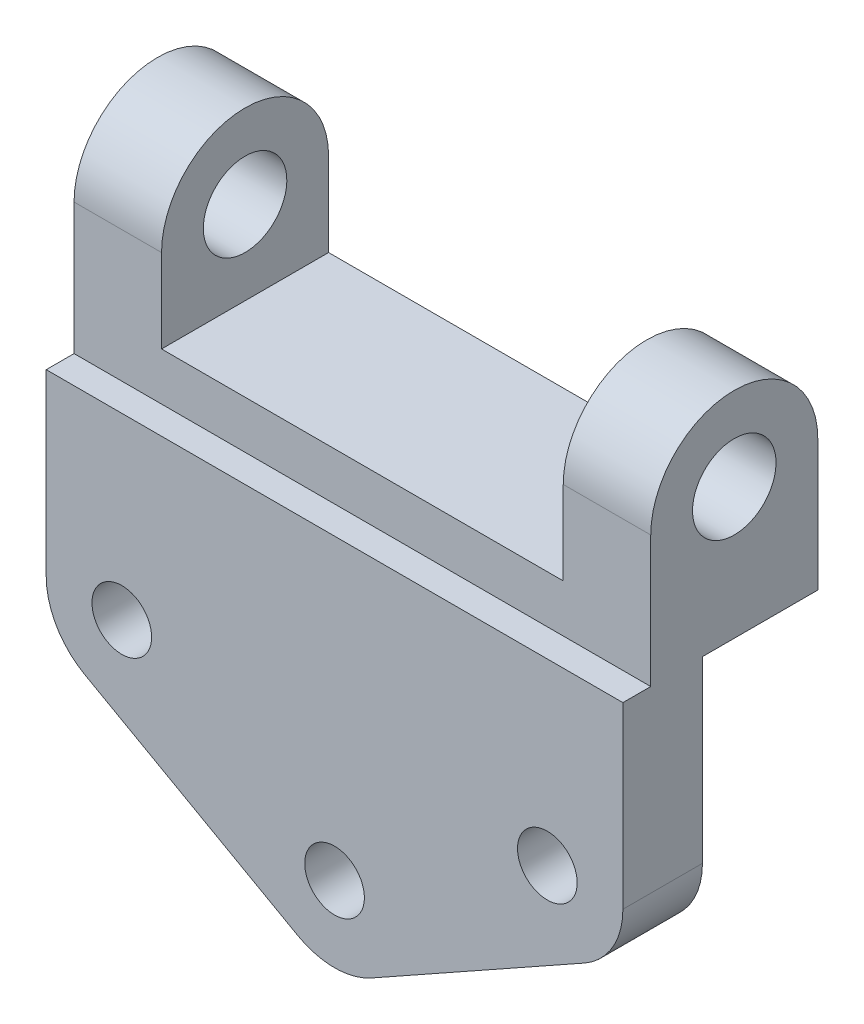
ISO-10303-21;
HEADER;
FILE_DESCRIPTION(('STEP AP214'),'2;1');
FILE_NAME('part.step','',(''),(''),'','','');
FILE_SCHEMA(('AUTOMOTIVE_DESIGN { 1 0 10303 214 1 1 1 1 }'));
ENDSEC;
DATA;
#1=APPLICATION_CONTEXT('core data for automotive mechanical design processes');
#2=APPLICATION_PROTOCOL_DEFINITION('international standard','automotive_design',2000,#1);
#3=PRODUCT_CONTEXT('',#1,'mechanical');
#4=PRODUCT('Part','Part','',(#3));
#5=PRODUCT_RELATED_PRODUCT_CATEGORY('part','',(#4));
#6=PRODUCT_DEFINITION_FORMATION('','',#4);
#7=PRODUCT_DEFINITION_CONTEXT('part definition',#1,'design');
#8=PRODUCT_DEFINITION('design','',#6,#7);
#9=PRODUCT_DEFINITION_SHAPE('','',#8);
#10=(LENGTH_UNIT() NAMED_UNIT(*) SI_UNIT(.MILLI.,.METRE.));
#11=(NAMED_UNIT(*) PLANE_ANGLE_UNIT() SI_UNIT($,.RADIAN.));
#12=(NAMED_UNIT(*) SI_UNIT($,.STERADIAN.) SOLID_ANGLE_UNIT());
#13=UNCERTAINTY_MEASURE_WITH_UNIT(LENGTH_MEASURE(1.E-05),#10,'distance_accuracy_value','');
#14=(GEOMETRIC_REPRESENTATION_CONTEXT(3) GLOBAL_UNCERTAINTY_ASSIGNED_CONTEXT((#13)) GLOBAL_UNIT_ASSIGNED_CONTEXT((#10,
#11,#12)) REPRESENTATION_CONTEXT('',''));
#15=CARTESIAN_POINT('',(0.,0.,0.));
#16=DIRECTION('',(0.,0.,1.));
#17=DIRECTION('',(1.,0.,0.));
#18=AXIS2_PLACEMENT_3D('',#15,#16,#17);
#19=CARTESIAN_POINT('',(72.5,0.,20.));
#20=DIRECTION('',(1.,0.,0.));
#21=DIRECTION('',(0.,1.,0.));
#22=AXIS2_PLACEMENT_3D('',#19,#20,#21);
#23=PLANE('',#22);
#24=CARTESIAN_POINT('',(72.5,33.,-8.));
#25=DIRECTION('',(1.,0.,0.));
#26=DIRECTION('',(0.,1.,0.));
#27=AXIS2_PLACEMENT_3D('',#24,#25,#26);
#28=CIRCLE('',#27,10.5);
#29=CARTESIAN_POINT('',(72.5,43.5,-8.));
#30=VERTEX_POINT('',#29);
#31=EDGE_CURVE('E557',#30,#30,#28,.T.);
#32=ORIENTED_EDGE('',*,*,#31,.F.);
#33=EDGE_LOOP('',(#32));
#34=FACE_BOUND('',#33,.T.);
#35=DIRECTION('',(0.,-1.,0.));
#36=VECTOR('',#35,1.);
#37=CARTESIAN_POINT('',(72.5,0.,-29.));
#38=LINE('',#37,#36);
#39=CARTESIAN_POINT('',(72.5,33.,-29.));
#40=VERTEX_POINT('',#39);
#41=CARTESIAN_POINT('',(72.5,0.,-29.));
#42=VERTEX_POINT('',#41);
#43=EDGE_CURVE('E232',#40,#42,#38,.T.);
#44=ORIENTED_EDGE('',*,*,#43,.F.);
#45=CARTESIAN_POINT('',(72.5,33.,-8.));
#46=DIRECTION('',(1.,0.,0.));
#47=DIRECTION('',(0.,1.,0.));
#48=AXIS2_PLACEMENT_3D('',#45,#46,#47);
#49=CIRCLE('',#48,21.);
#50=CARTESIAN_POINT('',(72.5,33.,13.));
#51=VERTEX_POINT('',#50);
#52=EDGE_CURVE('E216',#40,#51,#49,.T.);
#53=ORIENTED_EDGE('',*,*,#52,.T.);
#54=DIRECTION('',(0.,-1.,0.));
#55=VECTOR('',#54,1.);
#56=CARTESIAN_POINT('',(72.5,0.,13.));
#57=LINE('',#56,#55);
#58=CARTESIAN_POINT('',(72.5,0.,13.));
#59=VERTEX_POINT('',#58);
#60=EDGE_CURVE('E354',#51,#59,#57,.T.);
#61=ORIENTED_EDGE('',*,*,#60,.T.);
#62=DIRECTION('',(0.,0.,-1.));
#63=VECTOR('',#62,1.);
#64=CARTESIAN_POINT('',(72.5,0.,20.));
#65=LINE('',#64,#63);
#66=CARTESIAN_POINT('',(72.5,0.,20.));
#67=VERTEX_POINT('',#66);
#68=EDGE_CURVE('E334',#67,#59,#65,.T.);
#69=ORIENTED_EDGE('',*,*,#68,.F.);
#70=DIRECTION('',(0.,-1.,0.));
#71=VECTOR('',#70,1.);
#72=CARTESIAN_POINT('',(72.5,0.,20.));
#73=LINE('',#72,#71);
#74=CARTESIAN_POINT('',(72.5,-45.,20.));
#75=VERTEX_POINT('',#74);
#76=EDGE_CURVE('E276',#67,#75,#73,.T.);
#77=ORIENTED_EDGE('',*,*,#76,.T.);
#78=DIRECTION('',(0.,0.,-1.));
#79=VECTOR('',#78,1.);
#80=CARTESIAN_POINT('',(72.5,-45.,20.));
#81=LINE('',#80,#79);
#82=CARTESIAN_POINT('',(72.5,-45.,0.));
#83=VERTEX_POINT('',#82);
#84=EDGE_CURVE('E337',#75,#83,#81,.T.);
#85=ORIENTED_EDGE('',*,*,#84,.T.);
#86=DIRECTION('',(0.,-1.,0.));
#87=VECTOR('',#86,1.);
#88=CARTESIAN_POINT('',(72.5,0.,0.));
#89=LINE('',#88,#87);
#90=CARTESIAN_POINT('',(72.5,0.,0.));
#91=VERTEX_POINT('',#90);
#92=EDGE_CURVE('E309',#91,#83,#89,.T.);
#93=ORIENTED_EDGE('',*,*,#92,.F.);
#94=DIRECTION('',(0.,0.,-1.));
#95=VECTOR('',#94,1.);
#96=CARTESIAN_POINT('',(72.5,0.,13.));
#97=LINE('',#96,#95);
#98=EDGE_CURVE('E240',#91,#42,#97,.T.);
#99=ORIENTED_EDGE('',*,*,#98,.T.);
#100=EDGE_LOOP('',(#44,#53,#61,#69,#77,#85,#93,#99));
#101=FACE_BOUND('',#100,.T.);
#102=ADVANCED_FACE('F105',(#34,#101),#23,.T.);
#103=CARTESIAN_POINT('',(-72.5,0.,20.));
#104=DIRECTION('',(1.,0.,0.));
#105=DIRECTION('',(0.,1.,0.));
#106=AXIS2_PLACEMENT_3D('',#103,#104,#105);
#107=PLANE('',#106);
#108=CARTESIAN_POINT('',(-72.5,33.,-8.));
#109=DIRECTION('',(1.,0.,0.));
#110=DIRECTION('',(0.,1.,0.));
#111=AXIS2_PLACEMENT_3D('',#108,#109,#110);
#112=CIRCLE('',#111,10.5);
#113=CARTESIAN_POINT('',(-72.5,43.5,-8.));
#114=VERTEX_POINT('',#113);
#115=EDGE_CURVE('E227',#114,#114,#112,.T.);
#116=ORIENTED_EDGE('',*,*,#115,.T.);
#117=EDGE_LOOP('',(#116));
#118=FACE_BOUND('',#117,.T.);
#119=CARTESIAN_POINT('',(-72.5,33.,-8.));
#120=DIRECTION('',(1.,0.,0.));
#121=DIRECTION('',(0.,1.,0.));
#122=AXIS2_PLACEMENT_3D('',#119,#120,#121);
#123=CIRCLE('',#122,21.);
#124=CARTESIAN_POINT('',(-72.5,33.,-29.));
#125=VERTEX_POINT('',#124);
#126=CARTESIAN_POINT('',(-72.5,33.,13.));
#127=VERTEX_POINT('',#126);
#128=EDGE_CURVE('E244',#125,#127,#123,.T.);
#129=ORIENTED_EDGE('',*,*,#128,.F.);
#130=DIRECTION('',(0.,1.,0.));
#131=VECTOR('',#130,1.);
#132=CARTESIAN_POINT('',(-72.5,0.,-29.));
#133=LINE('',#132,#131);
#134=CARTESIAN_POINT('',(-72.5,0.,-29.));
#135=VERTEX_POINT('',#134);
#136=EDGE_CURVE('E250',#135,#125,#133,.T.);
#137=ORIENTED_EDGE('',*,*,#136,.F.);
#138=DIRECTION('',(0.,0.,-1.));
#139=VECTOR('',#138,1.);
#140=CARTESIAN_POINT('',(-72.5,0.,13.));
#141=LINE('',#140,#139);
#142=CARTESIAN_POINT('',(-72.5,0.,0.));
#143=VERTEX_POINT('',#142);
#144=EDGE_CURVE('E251',#143,#135,#141,.T.);
#145=ORIENTED_EDGE('',*,*,#144,.F.);
#146=DIRECTION('',(0.,-1.,0.));
#147=VECTOR('',#146,1.);
#148=CARTESIAN_POINT('',(-72.5,0.,0.));
#149=LINE('',#148,#147);
#150=CARTESIAN_POINT('',(-72.5,-45.,0.));
#151=VERTEX_POINT('',#150);
#152=EDGE_CURVE('E316',#143,#151,#149,.T.);
#153=ORIENTED_EDGE('',*,*,#152,.T.);
#154=DIRECTION('',(0.,0.,-1.));
#155=VECTOR('',#154,1.);
#156=CARTESIAN_POINT('',(-72.5,-45.,20.));
#157=LINE('',#156,#155);
#158=CARTESIAN_POINT('',(-72.5,-45.,20.));
#159=VERTEX_POINT('',#158);
#160=EDGE_CURVE('E330',#159,#151,#157,.T.);
#161=ORIENTED_EDGE('',*,*,#160,.F.);
#162=DIRECTION('',(0.,-1.,0.));
#163=VECTOR('',#162,1.);
#164=CARTESIAN_POINT('',(-72.5,0.,20.));
#165=LINE('',#164,#163);
#166=CARTESIAN_POINT('',(-72.5,0.,20.));
#167=VERTEX_POINT('',#166);
#168=EDGE_CURVE('E283',#167,#159,#165,.T.);
#169=ORIENTED_EDGE('',*,*,#168,.F.);
#170=DIRECTION('',(0.,0.,-1.));
#171=VECTOR('',#170,1.);
#172=CARTESIAN_POINT('',(-72.5,0.,20.));
#173=LINE('',#172,#171);
#174=CARTESIAN_POINT('',(-72.5,0.,13.));
#175=VERTEX_POINT('',#174);
#176=EDGE_CURVE('E329',#167,#175,#173,.T.);
#177=ORIENTED_EDGE('',*,*,#176,.T.);
#178=DIRECTION('',(0.,1.,0.));
#179=VECTOR('',#178,1.);
#180=CARTESIAN_POINT('',(-72.5,0.,13.));
#181=LINE('',#180,#179);
#182=EDGE_CURVE('E258',#175,#127,#181,.T.);
#183=ORIENTED_EDGE('',*,*,#182,.T.);
#184=EDGE_LOOP('',(#129,#137,#145,#153,#161,#169,#177,#183));
#185=FACE_BOUND('',#184,.T.);
#186=ADVANCED_FACE('F365',(#118,#185),#107,.F.);
#187=CARTESIAN_POINT('',(50.5,0.,13.));
#188=DIRECTION('',(1.,0.,0.));
#189=DIRECTION('',(0.,1.,0.));
#190=AXIS2_PLACEMENT_3D('',#187,#188,#189);
#191=PLANE('',#190);
#192=CARTESIAN_POINT('',(50.5,33.,-8.));
#193=DIRECTION('',(1.,0.,0.));
#194=DIRECTION('',(0.,1.,0.));
#195=AXIS2_PLACEMENT_3D('',#192,#193,#194);
#196=CIRCLE('',#195,10.5);
#197=CARTESIAN_POINT('',(50.5,43.5,-8.));
#198=VERTEX_POINT('',#197);
#199=EDGE_CURVE('E556',#198,#198,#196,.T.);
#200=ORIENTED_EDGE('',*,*,#199,.T.);
#201=EDGE_LOOP('',(#200));
#202=FACE_BOUND('',#201,.T.);
#203=CARTESIAN_POINT('',(50.5,33.,-8.));
#204=DIRECTION('',(1.,0.,0.));
#205=DIRECTION('',(0.,1.,0.));
#206=AXIS2_PLACEMENT_3D('',#203,#204,#205);
#207=CIRCLE('',#206,21.);
#208=CARTESIAN_POINT('',(50.5,33.,-29.));
#209=VERTEX_POINT('',#208);
#210=CARTESIAN_POINT('',(50.5,33.,13.));
#211=VERTEX_POINT('',#210);
#212=EDGE_CURVE('E116',#209,#211,#207,.T.);
#213=ORIENTED_EDGE('',*,*,#212,.F.);
#214=DIRECTION('',(0.,-1.,0.));
#215=VECTOR('',#214,1.);
#216=CARTESIAN_POINT('',(50.5,0.,-29.));
#217=LINE('',#216,#215);
#218=CARTESIAN_POINT('',(50.5,12.,-29.));
#219=VERTEX_POINT('',#218);
#220=EDGE_CURVE('E235',#209,#219,#217,.T.);
#221=ORIENTED_EDGE('',*,*,#220,.T.);
#222=DIRECTION('',(0.,0.,-1.));
#223=VECTOR('',#222,1.);
#224=CARTESIAN_POINT('',(50.5,12.,13.));
#225=LINE('',#224,#223);
#226=CARTESIAN_POINT('',(50.5,12.,13.));
#227=VERTEX_POINT('',#226);
#228=EDGE_CURVE('E259',#227,#219,#225,.T.);
#229=ORIENTED_EDGE('',*,*,#228,.F.);
#230=DIRECTION('',(0.,-1.,0.));
#231=VECTOR('',#230,1.);
#232=CARTESIAN_POINT('',(50.5,0.,13.));
#233=LINE('',#232,#231);
#234=EDGE_CURVE('E353',#211,#227,#233,.T.);
#235=ORIENTED_EDGE('',*,*,#234,.F.);
#236=EDGE_LOOP('',(#213,#221,#229,#235));
#237=FACE_BOUND('',#236,.T.);
#238=ADVANCED_FACE('F399',(#202,#237),#191,.F.);
#239=CARTESIAN_POINT('',(-50.5,0.,13.));
#240=DIRECTION('',(1.,0.,0.));
#241=DIRECTION('',(0.,1.,0.));
#242=AXIS2_PLACEMENT_3D('',#239,#240,#241);
#243=PLANE('',#242);
#244=CARTESIAN_POINT('',(-50.5,33.,-8.));
#245=DIRECTION('',(1.,0.,0.));
#246=DIRECTION('',(0.,1.,0.));
#247=AXIS2_PLACEMENT_3D('',#244,#245,#246);
#248=CIRCLE('',#247,10.5);
#249=CARTESIAN_POINT('',(-50.5,43.5,-8.));
#250=VERTEX_POINT('',#249);
#251=EDGE_CURVE('E106',#250,#250,#248,.T.);
#252=ORIENTED_EDGE('',*,*,#251,.F.);
#253=EDGE_LOOP('',(#252));
#254=FACE_BOUND('',#253,.T.);
#255=DIRECTION('',(0.,-1.,0.));
#256=VECTOR('',#255,1.);
#257=CARTESIAN_POINT('',(-50.5,0.,-29.));
#258=LINE('',#257,#256);
#259=CARTESIAN_POINT('',(-50.5,33.,-29.));
#260=VERTEX_POINT('',#259);
#261=CARTESIAN_POINT('',(-50.5,12.,-29.));
#262=VERTEX_POINT('',#261);
#263=EDGE_CURVE('E249',#260,#262,#258,.T.);
#264=ORIENTED_EDGE('',*,*,#263,.F.);
#265=CARTESIAN_POINT('',(-50.5,33.,-8.));
#266=DIRECTION('',(1.,0.,0.));
#267=DIRECTION('',(0.,1.,0.));
#268=AXIS2_PLACEMENT_3D('',#265,#266,#267);
#269=CIRCLE('',#268,21.);
#270=CARTESIAN_POINT('',(-50.5,33.,13.));
#271=VERTEX_POINT('',#270);
#272=EDGE_CURVE('E223',#260,#271,#269,.T.);
#273=ORIENTED_EDGE('',*,*,#272,.T.);
#274=DIRECTION('',(0.,-1.,0.));
#275=VECTOR('',#274,1.);
#276=CARTESIAN_POINT('',(-50.5,0.,13.));
#277=LINE('',#276,#275);
#278=CARTESIAN_POINT('',(-50.5,12.,13.));
#279=VERTEX_POINT('',#278);
#280=EDGE_CURVE('E360',#271,#279,#277,.T.);
#281=ORIENTED_EDGE('',*,*,#280,.T.);
#282=DIRECTION('',(0.,0.,-1.));
#283=VECTOR('',#282,1.);
#284=CARTESIAN_POINT('',(-50.5,12.,13.));
#285=LINE('',#284,#283);
#286=EDGE_CURVE('E254',#279,#262,#285,.T.);
#287=ORIENTED_EDGE('',*,*,#286,.T.);
#288=EDGE_LOOP('',(#264,#273,#281,#287));
#289=FACE_BOUND('',#288,.T.);
#290=ADVANCED_FACE('F374',(#254,#289),#243,.T.);
#291=CARTESIAN_POINT('',(-41.2883764302264,-73.6309379672371,20.));
#292=DIRECTION('',(0.489099736994159,0.872227864306251,0.));
#293=DIRECTION('',(-0.872227864306251,0.489099736994159,0.));
#294=AXIS2_PLACEMENT_3D('',#291,#292,#293);
#295=PLANE('',#294);
#296=DIRECTION('',(0.872227864306251,-0.489099736994159,0.));
#297=VECTOR('',#296,1.);
#298=CARTESIAN_POINT('',(-41.2883764302264,-73.6309379672371,0.));
#299=LINE('',#298,#297);
#300=CARTESIAN_POINT('',(-62.792895002889,-61.5723294218188,0.));
#301=VERTEX_POINT('',#300);
#302=CARTESIAN_POINT('',(-9.29289500288904,-91.5723294218188,0.));
#303=VERTEX_POINT('',#302);
#304=EDGE_CURVE('E299',#301,#303,#299,.T.);
#305=ORIENTED_EDGE('',*,*,#304,.T.);
#306=DIRECTION('',(0.,0.,-1.));
#307=VECTOR('',#306,1.);
#308=CARTESIAN_POINT('',(-9.29289500288904,-91.5723294218188,20.));
#309=LINE('',#308,#307);
#310=CARTESIAN_POINT('',(-9.29289500288904,-91.5723294218188,20.));
#311=VERTEX_POINT('',#310);
#312=EDGE_CURVE('E341',#311,#303,#309,.T.);
#313=ORIENTED_EDGE('',*,*,#312,.F.);
#314=DIRECTION('',(0.872227864306251,-0.489099736994159,0.));
#315=VECTOR('',#314,1.);
#316=CARTESIAN_POINT('',(-41.2883764302264,-73.6309379672371,20.));
#317=LINE('',#316,#315);
#318=CARTESIAN_POINT('',(-62.792895002889,-61.5723294218188,20.));
#319=VERTEX_POINT('',#318);
#320=EDGE_CURVE('E270',#319,#311,#317,.T.);
#321=ORIENTED_EDGE('',*,*,#320,.F.);
#322=DIRECTION('',(0.,0.,-1.));
#323=VECTOR('',#322,1.);
#324=CARTESIAN_POINT('',(-62.792895002889,-61.5723294218188,20.));
#325=LINE('',#324,#323);
#326=EDGE_CURVE('E293',#319,#301,#325,.T.);
#327=ORIENTED_EDGE('',*,*,#326,.T.);
#328=EDGE_LOOP('',(#305,#313,#321,#327));
#329=FACE_BOUND('',#328,.T.);
#330=ADVANCED_FACE('F415',(#329),#295,.F.);
#331=CARTESIAN_POINT('',(0.,-75.,20.));
#332=DIRECTION('',(0.,0.,-1.));
#333=DIRECTION('',(-1.,0.,0.));
#334=AXIS2_PLACEMENT_3D('',#331,#332,#333);
#335=CYLINDRICAL_SURFACE('',#334,19.);
#336=CARTESIAN_POINT('',(0.,-75.,0.));
#337=DIRECTION('',(0.,0.,1.));
#338=DIRECTION('',(1.,0.,0.));
#339=AXIS2_PLACEMENT_3D('',#336,#337,#338);
#340=CIRCLE('',#339,19.);
#341=CARTESIAN_POINT('',(9.29289500288904,-91.5723294218188,0.));
#342=VERTEX_POINT('',#341);
#343=EDGE_CURVE('E301',#303,#342,#340,.T.);
#344=ORIENTED_EDGE('',*,*,#343,.T.);
#345=DIRECTION('',(0.,0.,-1.));
#346=VECTOR('',#345,1.);
#347=CARTESIAN_POINT('',(9.29289500288904,-91.5723294218188,20.));
#348=LINE('',#347,#346);
#349=CARTESIAN_POINT('',(9.29289500288904,-91.5723294218188,20.));
#350=VERTEX_POINT('',#349);
#351=EDGE_CURVE('E338',#350,#342,#348,.T.);
#352=ORIENTED_EDGE('',*,*,#351,.F.);
#353=CARTESIAN_POINT('',(0.,-75.,20.));
#354=DIRECTION('',(0.,0.,1.));
#355=DIRECTION('',(1.,0.,0.));
#356=AXIS2_PLACEMENT_3D('',#353,#354,#355);
#357=CIRCLE('',#356,19.);
#358=EDGE_CURVE('E271',#311,#350,#357,.T.);
#359=ORIENTED_EDGE('',*,*,#358,.F.);
#360=ORIENTED_EDGE('',*,*,#312,.T.);
#361=EDGE_LOOP('',(#344,#352,#359,#360));
#362=FACE_BOUND('',#361,.T.);
#363=ADVANCED_FACE('F412',(#362),#335,.T.);
#364=CARTESIAN_POINT('',(41.2883764302264,-73.6309379672371,20.));
#365=DIRECTION('',(0.489099736994159,-0.872227864306251,0.));
#366=DIRECTION('',(0.872227864306251,0.489099736994159,0.));
#367=AXIS2_PLACEMENT_3D('',#364,#365,#366);
#368=PLANE('',#367);
#369=DIRECTION('',(-0.872227864306251,-0.489099736994159,0.));
#370=VECTOR('',#369,1.);
#371=CARTESIAN_POINT('',(41.2883764302264,-73.6309379672371,0.));
#372=LINE('',#371,#370);
#373=CARTESIAN_POINT('',(62.792895002889,-61.5723294218188,0.));
#374=VERTEX_POINT('',#373);
#375=EDGE_CURVE('E303',#374,#342,#372,.T.);
#376=ORIENTED_EDGE('',*,*,#375,.F.);
#377=DIRECTION('',(0.,0.,-1.));
#378=VECTOR('',#377,1.);
#379=CARTESIAN_POINT('',(62.792895002889,-61.5723294218188,20.));
#380=LINE('',#379,#378);
#381=CARTESIAN_POINT('',(62.792895002889,-61.5723294218188,20.));
#382=VERTEX_POINT('',#381);
#383=EDGE_CURVE('E339',#382,#374,#380,.T.);
#384=ORIENTED_EDGE('',*,*,#383,.F.);
#385=DIRECTION('',(-0.872227864306251,-0.489099736994159,0.));
#386=VECTOR('',#385,1.);
#387=CARTESIAN_POINT('',(41.2883764302264,-73.6309379672371,20.));
#388=LINE('',#387,#386);
#389=EDGE_CURVE('E272',#382,#350,#388,.T.);
#390=ORIENTED_EDGE('',*,*,#389,.T.);
#391=ORIENTED_EDGE('',*,*,#351,.T.);
#392=EDGE_LOOP('',(#376,#384,#390,#391));
#393=FACE_BOUND('',#392,.T.);
#394=ADVANCED_FACE('F409',(#393),#368,.T.);
#395=CARTESIAN_POINT('',(53.5,-45.,20.));
#396=DIRECTION('',(0.,0.,-1.));
#397=DIRECTION('',(-1.,0.,0.));
#398=AXIS2_PLACEMENT_3D('',#395,#396,#397);
#399=CYLINDRICAL_SURFACE('',#398,19.);
#400=CARTESIAN_POINT('',(53.5,-45.,0.));
#401=DIRECTION('',(0.,0.,1.));
#402=DIRECTION('',(1.,0.,0.));
#403=AXIS2_PLACEMENT_3D('',#400,#401,#402);
#404=CIRCLE('',#403,19.);
#405=EDGE_CURVE('E307',#83,#374,#404,.F.);
#406=ORIENTED_EDGE('',*,*,#405,.F.);
#407=ORIENTED_EDGE('',*,*,#84,.F.);
#408=CARTESIAN_POINT('',(53.5,-45.,20.));
#409=DIRECTION('',(0.,0.,1.));
#410=DIRECTION('',(1.,0.,0.));
#411=AXIS2_PLACEMENT_3D('',#408,#409,#410);
#412=CIRCLE('',#411,19.);
#413=EDGE_CURVE('E277',#75,#382,#412,.F.);
#414=ORIENTED_EDGE('',*,*,#413,.T.);
#415=ORIENTED_EDGE('',*,*,#383,.T.);
#416=EDGE_LOOP('',(#406,#407,#414,#415));
#417=FACE_BOUND('',#416,.T.);
#418=ADVANCED_FACE('F403',(#417),#399,.T.);
#419=CARTESIAN_POINT('',(0.,0.,20.));
#420=DIRECTION('',(0.,1.,0.));
#421=DIRECTION('',(0.,0.,1.));
#422=AXIS2_PLACEMENT_3D('',#419,#420,#421);
#423=PLANE('',#422);
#424=DIRECTION('',(1.,0.,0.));
#425=VECTOR('',#424,1.);
#426=CARTESIAN_POINT('',(0.,0.,13.));
#427=LINE('',#426,#425);
#428=EDGE_CURVE('E252',#175,#59,#427,.T.);
#429=ORIENTED_EDGE('',*,*,#428,.F.);
#430=ORIENTED_EDGE('',*,*,#176,.F.);
#431=DIRECTION('',(1.,0.,0.));
#432=VECTOR('',#431,1.);
#433=CARTESIAN_POINT('',(0.,0.,20.));
#434=LINE('',#433,#432);
#435=EDGE_CURVE('E285',#167,#67,#434,.T.);
#436=ORIENTED_EDGE('',*,*,#435,.T.);
#437=ORIENTED_EDGE('',*,*,#68,.T.);
#438=EDGE_LOOP('',(#429,#430,#436,#437));
#439=FACE_BOUND('',#438,.T.);
#440=ADVANCED_FACE('F404',(#439),#423,.T.);
#441=CARTESIAN_POINT('',(53.5,-45.,20.));
#442=DIRECTION('',(0.,0.,-1.));
#443=DIRECTION('',(-1.,0.,0.));
#444=AXIS2_PLACEMENT_3D('',#441,#442,#443);
#445=CYLINDRICAL_SURFACE('',#444,7.5);
#446=CARTESIAN_POINT('',(53.5,-45.,20.));
#447=DIRECTION('',(0.,0.,1.));
#448=DIRECTION('',(1.,0.,0.));
#449=AXIS2_PLACEMENT_3D('',#446,#447,#448);
#450=CIRCLE('',#449,7.5);
#451=CARTESIAN_POINT('',(61.,-45.,20.));
#452=VERTEX_POINT('',#451);
#453=EDGE_CURVE('E288',#452,#452,#450,.F.);
#454=ORIENTED_EDGE('',*,*,#453,.F.);
#455=EDGE_LOOP('',(#454));
#456=FACE_BOUND('',#455,.T.);
#457=CARTESIAN_POINT('',(53.5,-45.,0.));
#458=DIRECTION('',(0.,0.,1.));
#459=DIRECTION('',(1.,0.,0.));
#460=AXIS2_PLACEMENT_3D('',#457,#458,#459);
#461=CIRCLE('',#460,7.5);
#462=CARTESIAN_POINT('',(61.,-45.,0.));
#463=VERTEX_POINT('',#462);
#464=EDGE_CURVE('E319',#463,#463,#461,.F.);
#465=ORIENTED_EDGE('',*,*,#464,.T.);
#466=EDGE_LOOP('',(#465));
#467=FACE_BOUND('',#466,.T.);
#468=ADVANCED_FACE('F447',(#456,#467),#445,.F.);
#469=CARTESIAN_POINT('',(-53.5,-45.,20.));
#470=DIRECTION('',(0.,0.,-1.));
#471=DIRECTION('',(-1.,0.,0.));
#472=AXIS2_PLACEMENT_3D('',#469,#470,#471);
#473=CYLINDRICAL_SURFACE('',#472,19.);
#474=CARTESIAN_POINT('',(-53.5,-45.,0.));
#475=DIRECTION('',(0.,0.,1.));
#476=DIRECTION('',(1.,0.,0.));
#477=AXIS2_PLACEMENT_3D('',#474,#475,#476);
#478=CIRCLE('',#477,19.);
#479=EDGE_CURVE('E318',#151,#301,#478,.T.);
#480=ORIENTED_EDGE('',*,*,#479,.T.);
#481=ORIENTED_EDGE('',*,*,#326,.F.);
#482=CARTESIAN_POINT('',(-53.5,-45.,20.));
#483=DIRECTION('',(0.,0.,1.));
#484=DIRECTION('',(1.,0.,0.));
#485=AXIS2_PLACEMENT_3D('',#482,#483,#484);
#486=CIRCLE('',#485,19.);
#487=EDGE_CURVE('E287',#159,#319,#486,.T.);
#488=ORIENTED_EDGE('',*,*,#487,.F.);
#489=ORIENTED_EDGE('',*,*,#160,.T.);
#490=EDGE_LOOP('',(#480,#481,#488,#489));
#491=FACE_BOUND('',#490,.T.);
#492=ADVANCED_FACE('F441',(#491),#473,.T.);
#493=CARTESIAN_POINT('',(0.,-75.,20.));
#494=DIRECTION('',(0.,0.,-1.));
#495=DIRECTION('',(-1.,0.,0.));
#496=AXIS2_PLACEMENT_3D('',#493,#494,#495);
#497=CYLINDRICAL_SURFACE('',#496,7.5);
#498=CARTESIAN_POINT('',(0.,-75.,20.));
#499=DIRECTION('',(0.,0.,1.));
#500=DIRECTION('',(1.,0.,0.));
#501=AXIS2_PLACEMENT_3D('',#498,#499,#500);
#502=CIRCLE('',#501,7.5);
#503=CARTESIAN_POINT('',(7.5,-75.,20.));
#504=VERTEX_POINT('',#503);
#505=EDGE_CURVE('E262',#504,#504,#502,.T.);
#506=ORIENTED_EDGE('',*,*,#505,.T.);
#507=EDGE_LOOP('',(#506));
#508=FACE_BOUND('',#507,.T.);
#509=CARTESIAN_POINT('',(0.,-75.,0.));
#510=DIRECTION('',(0.,0.,1.));
#511=DIRECTION('',(1.,0.,0.));
#512=AXIS2_PLACEMENT_3D('',#509,#510,#511);
#513=CIRCLE('',#512,7.5);
#514=CARTESIAN_POINT('',(7.5,-75.,0.));
#515=VERTEX_POINT('',#514);
#516=EDGE_CURVE('E263',#515,#515,#513,.T.);
#517=ORIENTED_EDGE('',*,*,#516,.F.);
#518=EDGE_LOOP('',(#517));
#519=FACE_BOUND('',#518,.T.);
#520=ADVANCED_FACE('F102',(#508,#519),#497,.F.);
#521=CARTESIAN_POINT('',(-53.5,-45.,20.));
#522=DIRECTION('',(0.,0.,-1.));
#523=DIRECTION('',(-1.,0.,0.));
#524=AXIS2_PLACEMENT_3D('',#521,#522,#523);
#525=CYLINDRICAL_SURFACE('',#524,7.5);
#526=CARTESIAN_POINT('',(-53.5,-45.,20.));
#527=DIRECTION('',(0.,0.,1.));
#528=DIRECTION('',(1.,0.,0.));
#529=AXIS2_PLACEMENT_3D('',#526,#527,#528);
#530=CIRCLE('',#529,7.5);
#531=CARTESIAN_POINT('',(-46.,-45.,20.));
#532=VERTEX_POINT('',#531);
#533=EDGE_CURVE('E295',#532,#532,#530,.T.);
#534=ORIENTED_EDGE('',*,*,#533,.T.);
#535=EDGE_LOOP('',(#534));
#536=FACE_BOUND('',#535,.T.);
#537=CARTESIAN_POINT('',(-53.5,-45.,0.));
#538=DIRECTION('',(0.,0.,1.));
#539=DIRECTION('',(1.,0.,0.));
#540=AXIS2_PLACEMENT_3D('',#537,#538,#539);
#541=CIRCLE('',#540,7.5);
#542=CARTESIAN_POINT('',(-46.,-45.,0.));
#543=VERTEX_POINT('',#542);
#544=EDGE_CURVE('E268',#543,#543,#541,.T.);
#545=ORIENTED_EDGE('',*,*,#544,.F.);
#546=EDGE_LOOP('',(#545));
#547=FACE_BOUND('',#546,.T.);
#548=ADVANCED_FACE('F452',(#536,#547),#525,.F.);
#549=CARTESIAN_POINT('',(0.,0.,20.));
#550=DIRECTION('',(0.,0.,1.));
#551=DIRECTION('',(1.,0.,0.));
#552=AXIS2_PLACEMENT_3D('',#549,#550,#551);
#553=PLANE('',#552);
#554=ORIENTED_EDGE('',*,*,#505,.F.);
#555=EDGE_LOOP('',(#554));
#556=FACE_BOUND('',#555,.T.);
#557=ORIENTED_EDGE('',*,*,#320,.T.);
#558=ORIENTED_EDGE('',*,*,#358,.T.);
#559=ORIENTED_EDGE('',*,*,#389,.F.);
#560=ORIENTED_EDGE('',*,*,#413,.F.);
#561=ORIENTED_EDGE('',*,*,#76,.F.);
#562=ORIENTED_EDGE('',*,*,#435,.F.);
#563=ORIENTED_EDGE('',*,*,#168,.T.);
#564=ORIENTED_EDGE('',*,*,#487,.T.);
#565=EDGE_LOOP('',(#557,#558,#559,#560,#561,#562,#563,#564));
#566=FACE_BOUND('',#565,.T.);
#567=ORIENTED_EDGE('',*,*,#453,.T.);
#568=EDGE_LOOP('',(#567));
#569=FACE_BOUND('',#568,.T.);
#570=ORIENTED_EDGE('',*,*,#533,.F.);
#571=EDGE_LOOP('',(#570));
#572=FACE_BOUND('',#571,.T.);
#573=ADVANCED_FACE('F434',(#556,#566,#569,#572),#553,.T.);
#574=CARTESIAN_POINT('',(0.,0.,0.));
#575=DIRECTION('',(0.,0.,1.));
#576=DIRECTION('',(1.,0.,0.));
#577=AXIS2_PLACEMENT_3D('',#574,#575,#576);
#578=PLANE('',#577);
#579=ORIENTED_EDGE('',*,*,#516,.T.);
#580=EDGE_LOOP('',(#579));
#581=FACE_BOUND('',#580,.T.);
#582=ORIENTED_EDGE('',*,*,#304,.F.);
#583=ORIENTED_EDGE('',*,*,#479,.F.);
#584=ORIENTED_EDGE('',*,*,#152,.F.);
#585=DIRECTION('',(1.,0.,0.));
#586=VECTOR('',#585,1.);
#587=CARTESIAN_POINT('',(0.,0.,0.));
#588=LINE('',#587,#586);
#589=EDGE_CURVE('E311',#143,#91,#588,.T.);
#590=ORIENTED_EDGE('',*,*,#589,.T.);
#591=ORIENTED_EDGE('',*,*,#92,.T.);
#592=ORIENTED_EDGE('',*,*,#405,.T.);
#593=ORIENTED_EDGE('',*,*,#375,.T.);
#594=ORIENTED_EDGE('',*,*,#343,.F.);
#595=EDGE_LOOP('',(#582,#583,#584,#590,#591,#592,#593,#594));
#596=FACE_BOUND('',#595,.T.);
#597=ORIENTED_EDGE('',*,*,#464,.F.);
#598=EDGE_LOOP('',(#597));
#599=FACE_BOUND('',#598,.T.);
#600=ORIENTED_EDGE('',*,*,#544,.T.);
#601=EDGE_LOOP('',(#600));
#602=FACE_BOUND('',#601,.T.);
#603=ADVANCED_FACE('F428',(#581,#596,#599,#602),#578,.F.);
#604=CARTESIAN_POINT('',(0.,0.,13.));
#605=DIRECTION('',(0.,1.,0.));
#606=DIRECTION('',(0.,0.,1.));
#607=AXIS2_PLACEMENT_3D('',#604,#605,#606);
#608=PLANE('',#607);
#609=ORIENTED_EDGE('',*,*,#589,.F.);
#610=ORIENTED_EDGE('',*,*,#144,.T.);
#611=DIRECTION('',(1.,0.,0.));
#612=VECTOR('',#611,1.);
#613=CARTESIAN_POINT('',(0.,0.,-29.));
#614=LINE('',#613,#612);
#615=EDGE_CURVE('E239',#135,#42,#614,.T.);
#616=ORIENTED_EDGE('',*,*,#615,.T.);
#617=ORIENTED_EDGE('',*,*,#98,.F.);
#618=EDGE_LOOP('',(#609,#610,#616,#617));
#619=FACE_BOUND('',#618,.T.);
#620=ADVANCED_FACE('F465',(#619),#608,.F.);
#621=CARTESIAN_POINT('',(0.,12.,13.));
#622=DIRECTION('',(0.,1.,0.));
#623=DIRECTION('',(0.,0.,1.));
#624=AXIS2_PLACEMENT_3D('',#621,#622,#623);
#625=PLANE('',#624);
#626=DIRECTION('',(1.,0.,0.));
#627=VECTOR('',#626,1.);
#628=CARTESIAN_POINT('',(0.,12.,-29.));
#629=LINE('',#628,#627);
#630=EDGE_CURVE('E242',#262,#219,#629,.T.);
#631=ORIENTED_EDGE('',*,*,#630,.F.);
#632=ORIENTED_EDGE('',*,*,#286,.F.);
#633=DIRECTION('',(1.,0.,0.));
#634=VECTOR('',#633,1.);
#635=CARTESIAN_POINT('',(0.,12.,13.));
#636=LINE('',#635,#634);
#637=EDGE_CURVE('E357',#279,#227,#636,.T.);
#638=ORIENTED_EDGE('',*,*,#637,.T.);
#639=ORIENTED_EDGE('',*,*,#228,.T.);
#640=EDGE_LOOP('',(#631,#632,#638,#639));
#641=FACE_BOUND('',#640,.T.);
#642=ADVANCED_FACE('F378',(#641),#625,.T.);
#643=CARTESIAN_POINT('',(0.,0.,13.));
#644=DIRECTION('',(0.,0.,1.));
#645=DIRECTION('',(1.,0.,0.));
#646=AXIS2_PLACEMENT_3D('',#643,#644,#645);
#647=PLANE('',#646);
#648=DIRECTION('',(1.,0.,0.));
#649=VECTOR('',#648,1.);
#650=CARTESIAN_POINT('',(-73.5,33.,13.));
#651=LINE('',#650,#649);
#652=EDGE_CURVE('E130',#127,#271,#651,.T.);
#653=ORIENTED_EDGE('',*,*,#652,.F.);
#654=ORIENTED_EDGE('',*,*,#182,.F.);
#655=ORIENTED_EDGE('',*,*,#428,.T.);
#656=ORIENTED_EDGE('',*,*,#60,.F.);
#657=EDGE_CURVE('E222',#211,#51,#651,.T.);
#658=ORIENTED_EDGE('',*,*,#657,.F.);
#659=ORIENTED_EDGE('',*,*,#234,.T.);
#660=ORIENTED_EDGE('',*,*,#637,.F.);
#661=ORIENTED_EDGE('',*,*,#280,.F.);
#662=EDGE_LOOP('',(#653,#654,#655,#656,#658,#659,#660,#661));
#663=FACE_BOUND('',#662,.T.);
#664=ADVANCED_FACE('F369',(#663),#647,.T.);
#665=CARTESIAN_POINT('',(0.,0.,-29.));
#666=DIRECTION('',(0.,0.,1.));
#667=DIRECTION('',(1.,0.,0.));
#668=AXIS2_PLACEMENT_3D('',#665,#666,#667);
#669=PLANE('',#668);
#670=ORIENTED_EDGE('',*,*,#136,.T.);
#671=DIRECTION('',(1.,0.,0.));
#672=VECTOR('',#671,1.);
#673=CARTESIAN_POINT('',(-73.5,33.,-29.));
#674=LINE('',#673,#672);
#675=EDGE_CURVE('E12',#125,#260,#674,.T.);
#676=ORIENTED_EDGE('',*,*,#675,.T.);
#677=ORIENTED_EDGE('',*,*,#263,.T.);
#678=ORIENTED_EDGE('',*,*,#630,.T.);
#679=ORIENTED_EDGE('',*,*,#220,.F.);
#680=EDGE_CURVE('E112',#209,#40,#674,.T.);
#681=ORIENTED_EDGE('',*,*,#680,.T.);
#682=ORIENTED_EDGE('',*,*,#43,.T.);
#683=ORIENTED_EDGE('',*,*,#615,.F.);
#684=EDGE_LOOP('',(#670,#676,#677,#678,#679,#681,#682,#683));
#685=FACE_BOUND('',#684,.T.);
#686=ADVANCED_FACE('F228',(#685),#669,.F.);
#687=CARTESIAN_POINT('',(-73.5,33.,-8.));
#688=DIRECTION('',(1.,0.,0.));
#689=DIRECTION('',(0.,1.,0.));
#690=AXIS2_PLACEMENT_3D('',#687,#688,#689);
#691=CYLINDRICAL_SURFACE('',#690,21.);
#692=ORIENTED_EDGE('',*,*,#128,.T.);
#693=ORIENTED_EDGE('',*,*,#652,.T.);
#694=ORIENTED_EDGE('',*,*,#272,.F.);
#695=ORIENTED_EDGE('',*,*,#675,.F.);
#696=EDGE_LOOP('',(#692,#693,#694,#695));
#697=FACE_BOUND('',#696,.T.);
#698=ADVANCED_FACE('F379',(#697),#691,.T.);
#699=ORIENTED_EDGE('',*,*,#212,.T.);
#700=ORIENTED_EDGE('',*,*,#657,.T.);
#701=ORIENTED_EDGE('',*,*,#52,.F.);
#702=ORIENTED_EDGE('',*,*,#680,.F.);
#703=EDGE_LOOP('',(#699,#700,#701,#702));
#704=FACE_BOUND('',#703,.T.);
#705=ADVANCED_FACE('F217',(#704),#691,.T.);
#706=CARTESIAN_POINT('',(-73.5,33.,-8.));
#707=DIRECTION('',(1.,0.,0.));
#708=DIRECTION('',(0.,1.,0.));
#709=AXIS2_PLACEMENT_3D('',#706,#707,#708);
#710=CYLINDRICAL_SURFACE('',#709,10.5);
#711=ORIENTED_EDGE('',*,*,#251,.T.);
#712=EDGE_LOOP('',(#711));
#713=FACE_BOUND('',#712,.T.);
#714=ORIENTED_EDGE('',*,*,#115,.F.);
#715=EDGE_LOOP('',(#714));
#716=FACE_BOUND('',#715,.T.);
#717=ADVANCED_FACE('F390',(#713,#716),#710,.F.);
#718=ORIENTED_EDGE('',*,*,#31,.T.);
#719=EDGE_LOOP('',(#718));
#720=FACE_BOUND('',#719,.T.);
#721=ORIENTED_EDGE('',*,*,#199,.F.);
#722=EDGE_LOOP('',(#721));
#723=FACE_BOUND('',#722,.T.);
#724=ADVANCED_FACE('F540',(#720,#723),#710,.F.);
#725=CLOSED_SHELL('',(#102,#186,#238,#290,#330,#363,#394,#418,#440,#468,#492,#520,#548,#573,
#603,#620,#642,#664,#686,#698,#705,#717,#724));
#726=MANIFOLD_SOLID_BREP('B2',#725);
#727=ADVANCED_BREP_SHAPE_REPRESENTATION('',(#18,#726),#14);
#728=SHAPE_DEFINITION_REPRESENTATION(#9,#727);
ENDSEC;
END-ISO-10303-21;
